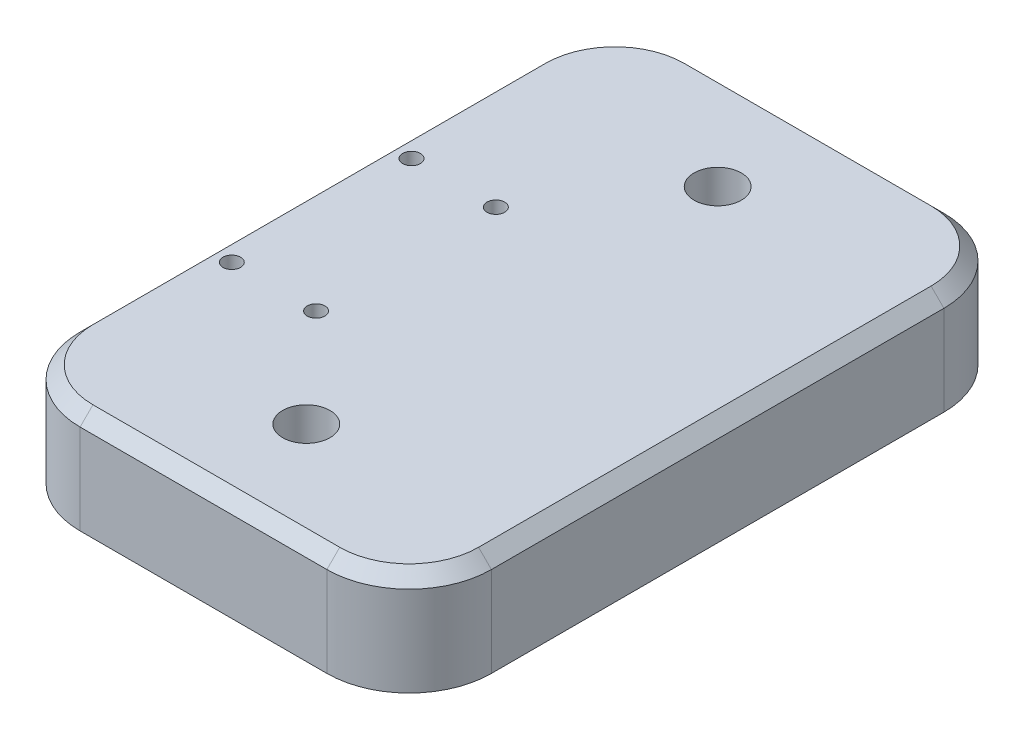
ISO-10303-21;
HEADER;
FILE_DESCRIPTION(('STEP AP214'),'2;1');
FILE_NAME('part.step','',(''),(''),'','','');
FILE_SCHEMA(('AUTOMOTIVE_DESIGN { 1 0 10303 214 1 1 1 1 }'));
ENDSEC;
DATA;
#1=APPLICATION_CONTEXT('core data for automotive mechanical design processes');
#2=APPLICATION_PROTOCOL_DEFINITION('international standard','automotive_design',2000,#1);
#3=PRODUCT_CONTEXT('',#1,'mechanical');
#4=PRODUCT('Part','Part','',(#3));
#5=PRODUCT_RELATED_PRODUCT_CATEGORY('part','',(#4));
#6=PRODUCT_DEFINITION_FORMATION('','',#4);
#7=PRODUCT_DEFINITION_CONTEXT('part definition',#1,'design');
#8=PRODUCT_DEFINITION('design','',#6,#7);
#9=PRODUCT_DEFINITION_SHAPE('','',#8);
#10=(LENGTH_UNIT() NAMED_UNIT(*) SI_UNIT(.MILLI.,.METRE.));
#11=(NAMED_UNIT(*) PLANE_ANGLE_UNIT() SI_UNIT($,.RADIAN.));
#12=(NAMED_UNIT(*) SI_UNIT($,.STERADIAN.) SOLID_ANGLE_UNIT());
#13=UNCERTAINTY_MEASURE_WITH_UNIT(LENGTH_MEASURE(1.E-05),#10,'distance_accuracy_value','');
#14=(GEOMETRIC_REPRESENTATION_CONTEXT(3) GLOBAL_UNCERTAINTY_ASSIGNED_CONTEXT((#13)) GLOBAL_UNIT_ASSIGNED_CONTEXT((#10,
#11,#12)) REPRESENTATION_CONTEXT('',''));
#15=CARTESIAN_POINT('',(0.,0.,0.));
#16=DIRECTION('',(0.,0.,1.));
#17=DIRECTION('',(1.,0.,0.));
#18=AXIS2_PLACEMENT_3D('',#15,#16,#17);
#19=CARTESIAN_POINT('',(50.8,12.7,0.));
#20=DIRECTION('',(0.,0.,-1.));
#21=DIRECTION('',(0.,1.,0.));
#22=AXIS2_PLACEMENT_3D('',#19,#20,#21);
#23=PLANE('',#22);
#24=DIRECTION('',(0.,-1.,0.));
#25=VECTOR('',#24,1.);
#26=CARTESIAN_POINT('',(40.64,12.7,0.));
#27=LINE('',#26,#25);
#28=CARTESIAN_POINT('',(40.64,0.,0.));
#29=VERTEX_POINT('',#28);
#30=CARTESIAN_POINT('',(40.64,11.1125,0.));
#31=VERTEX_POINT('',#30);
#32=EDGE_CURVE('E149',#29,#31,#27,.F.);
#33=ORIENTED_EDGE('',*,*,#32,.T.);
#34=DIRECTION('',(-1.,0.,0.));
#35=VECTOR('',#34,1.);
#36=CARTESIAN_POINT('',(50.8,11.1125,0.));
#37=LINE('',#36,#35);
#38=CARTESIAN_POINT('',(10.16,11.1125,0.));
#39=VERTEX_POINT('',#38);
#40=EDGE_CURVE('E225',#31,#39,#37,.T.);
#41=ORIENTED_EDGE('',*,*,#40,.T.);
#42=DIRECTION('',(0.,-1.,0.));
#43=VECTOR('',#42,1.);
#44=CARTESIAN_POINT('',(10.16,0.,0.));
#45=LINE('',#44,#43);
#46=CARTESIAN_POINT('',(10.16,0.,0.));
#47=VERTEX_POINT('',#46);
#48=EDGE_CURVE('E152',#39,#47,#45,.T.);
#49=ORIENTED_EDGE('',*,*,#48,.T.);
#50=DIRECTION('',(-1.,0.,0.));
#51=VECTOR('',#50,1.);
#52=CARTESIAN_POINT('',(50.8,0.,0.));
#53=LINE('',#52,#51);
#54=EDGE_CURVE('E137',#29,#47,#53,.T.);
#55=ORIENTED_EDGE('',*,*,#54,.F.);
#56=EDGE_LOOP('',(#33,#41,#49,#55));
#57=FACE_BOUND('',#56,.T.);
#58=ADVANCED_FACE('F41',(#57),#23,.F.);
#59=CARTESIAN_POINT('',(50.8,0.,-76.2));
#60=DIRECTION('',(0.,1.,0.));
#61=DIRECTION('',(0.,0.,1.));
#62=AXIS2_PLACEMENT_3D('',#59,#60,#61);
#63=PLANE('',#62);
#64=CARTESIAN_POINT('',(25.4,0.,-63.5));
#65=DIRECTION('',(0.,-1.,0.));
#66=DIRECTION('',(0.,0.,-1.));
#67=AXIS2_PLACEMENT_3D('',#64,#65,#66);
#68=CIRCLE('',#67,2.921);
#69=CARTESIAN_POINT('',(25.4,0.,-66.421));
#70=VERTEX_POINT('',#69);
#71=EDGE_CURVE('E288',#70,#70,#68,.T.);
#72=ORIENTED_EDGE('',*,*,#71,.F.);
#73=EDGE_LOOP('',(#72));
#74=FACE_BOUND('',#73,.T.);
#75=CARTESIAN_POINT('',(25.4,0.,-12.7));
#76=DIRECTION('',(0.,-1.,0.));
#77=DIRECTION('',(0.,0.,-1.));
#78=AXIS2_PLACEMENT_3D('',#75,#76,#77);
#79=CIRCLE('',#78,2.921);
#80=CARTESIAN_POINT('',(25.4,0.,-15.621));
#81=VERTEX_POINT('',#80);
#82=EDGE_CURVE('E296',#81,#81,#79,.T.);
#83=ORIENTED_EDGE('',*,*,#82,.F.);
#84=EDGE_LOOP('',(#83));
#85=FACE_BOUND('',#84,.T.);
#86=CARTESIAN_POINT('',(3.4925,0.,-25.4));
#87=DIRECTION('',(0.,-1.,0.));
#88=DIRECTION('',(0.,0.,-1.));
#89=AXIS2_PLACEMENT_3D('',#86,#87,#88);
#90=CIRCLE('',#89,1.0922);
#91=CARTESIAN_POINT('',(3.4925,0.,-26.4922));
#92=VERTEX_POINT('',#91);
#93=EDGE_CURVE('E304',#92,#92,#90,.T.);
#94=ORIENTED_EDGE('',*,*,#93,.F.);
#95=EDGE_LOOP('',(#94));
#96=FACE_BOUND('',#95,.T.);
#97=CARTESIAN_POINT('',(3.4925,0.,-47.5996));
#98=DIRECTION('',(0.,-1.,0.));
#99=DIRECTION('',(0.,0.,-1.));
#100=AXIS2_PLACEMENT_3D('',#97,#98,#99);
#101=CIRCLE('',#100,1.0922);
#102=CARTESIAN_POINT('',(3.4925,0.,-48.6918));
#103=VERTEX_POINT('',#102);
#104=EDGE_CURVE('E280',#103,#103,#101,.T.);
#105=ORIENTED_EDGE('',*,*,#104,.F.);
#106=EDGE_LOOP('',(#105));
#107=FACE_BOUND('',#106,.T.);
#108=CARTESIAN_POINT('',(13.9065,0.,-47.5996));
#109=DIRECTION('',(0.,-1.,0.));
#110=DIRECTION('',(0.,0.,-1.));
#111=AXIS2_PLACEMENT_3D('',#108,#109,#110);
#112=CIRCLE('',#111,1.0922);
#113=CARTESIAN_POINT('',(13.9065,0.,-48.6918));
#114=VERTEX_POINT('',#113);
#115=EDGE_CURVE('E267',#114,#114,#112,.T.);
#116=ORIENTED_EDGE('',*,*,#115,.F.);
#117=EDGE_LOOP('',(#116));
#118=FACE_BOUND('',#117,.T.);
#119=CARTESIAN_POINT('',(13.9065,0.,-25.4));
#120=DIRECTION('',(0.,-1.,0.));
#121=DIRECTION('',(0.,0.,-1.));
#122=AXIS2_PLACEMENT_3D('',#119,#120,#121);
#123=CIRCLE('',#122,1.0922);
#124=CARTESIAN_POINT('',(13.9065,0.,-26.4922));
#125=VERTEX_POINT('',#124);
#126=EDGE_CURVE('E287',#125,#125,#123,.T.);
#127=ORIENTED_EDGE('',*,*,#126,.F.);
#128=EDGE_LOOP('',(#127));
#129=FACE_BOUND('',#128,.T.);
#130=ORIENTED_EDGE('',*,*,#54,.T.);
#131=CARTESIAN_POINT('',(10.16,0.,-10.16));
#132=DIRECTION('',(0.,1.,0.));
#133=DIRECTION('',(0.,0.,1.));
#134=AXIS2_PLACEMENT_3D('',#131,#132,#133);
#135=CIRCLE('',#134,10.16);
#136=CARTESIAN_POINT('',(0.,0.,-10.16));
#137=VERTEX_POINT('',#136);
#138=EDGE_CURVE('E144',#47,#137,#135,.F.);
#139=ORIENTED_EDGE('',*,*,#138,.T.);
#140=DIRECTION('',(0.,0.,-1.));
#141=VECTOR('',#140,1.);
#142=CARTESIAN_POINT('',(0.,0.,-76.2));
#143=LINE('',#142,#141);
#144=CARTESIAN_POINT('',(0.,0.,-66.04));
#145=VERTEX_POINT('',#144);
#146=EDGE_CURVE('E319',#137,#145,#143,.T.);
#147=ORIENTED_EDGE('',*,*,#146,.T.);
#148=CARTESIAN_POINT('',(10.16,0.,-66.04));
#149=DIRECTION('',(0.,1.,0.));
#150=DIRECTION('',(0.,0.,1.));
#151=AXIS2_PLACEMENT_3D('',#148,#149,#150);
#152=CIRCLE('',#151,10.16);
#153=CARTESIAN_POINT('',(10.16,0.,-76.2));
#154=VERTEX_POINT('',#153);
#155=EDGE_CURVE('E145',#145,#154,#152,.F.);
#156=ORIENTED_EDGE('',*,*,#155,.T.);
#157=DIRECTION('',(-1.,0.,0.));
#158=VECTOR('',#157,1.);
#159=CARTESIAN_POINT('',(50.8,0.,-76.2));
#160=LINE('',#159,#158);
#161=CARTESIAN_POINT('',(40.64,0.,-76.2));
#162=VERTEX_POINT('',#161);
#163=EDGE_CURVE('E155',#162,#154,#160,.T.);
#164=ORIENTED_EDGE('',*,*,#163,.F.);
#165=CARTESIAN_POINT('',(40.64,0.,-66.04));
#166=DIRECTION('',(0.,1.,0.));
#167=DIRECTION('',(0.,0.,1.));
#168=AXIS2_PLACEMENT_3D('',#165,#166,#167);
#169=CIRCLE('',#168,10.16);
#170=CARTESIAN_POINT('',(50.8,0.,-66.04));
#171=VERTEX_POINT('',#170);
#172=EDGE_CURVE('E163',#162,#171,#169,.F.);
#173=ORIENTED_EDGE('',*,*,#172,.T.);
#174=DIRECTION('',(0.,0.,-1.));
#175=VECTOR('',#174,1.);
#176=CARTESIAN_POINT('',(50.8,0.,-76.2));
#177=LINE('',#176,#175);
#178=CARTESIAN_POINT('',(50.8,0.,-10.16));
#179=VERTEX_POINT('',#178);
#180=EDGE_CURVE('E139',#179,#171,#177,.T.);
#181=ORIENTED_EDGE('',*,*,#180,.F.);
#182=CARTESIAN_POINT('',(40.64,0.,-10.16));
#183=DIRECTION('',(0.,1.,0.));
#184=DIRECTION('',(0.,0.,1.));
#185=AXIS2_PLACEMENT_3D('',#182,#183,#184);
#186=CIRCLE('',#185,10.16);
#187=EDGE_CURVE('E134',#179,#29,#186,.F.);
#188=ORIENTED_EDGE('',*,*,#187,.T.);
#189=EDGE_LOOP('',(#130,#139,#147,#156,#164,#173,#181,#188));
#190=FACE_BOUND('',#189,.T.);
#191=ADVANCED_FACE('F136',(#74,#85,#96,#107,#118,#129,#190),#63,.F.);
#192=CARTESIAN_POINT('',(50.8,12.7,-76.2));
#193=DIRECTION('',(0.,0.,1.));
#194=DIRECTION('',(1.,0.,0.));
#195=AXIS2_PLACEMENT_3D('',#192,#193,#194);
#196=PLANE('',#195);
#197=DIRECTION('',(0.,1.,0.));
#198=VECTOR('',#197,1.);
#199=CARTESIAN_POINT('',(10.16,12.7,-76.2));
#200=LINE('',#199,#198);
#201=CARTESIAN_POINT('',(10.16,11.1125,-76.2));
#202=VERTEX_POINT('',#201);
#203=EDGE_CURVE('E190',#154,#202,#200,.T.);
#204=ORIENTED_EDGE('',*,*,#203,.T.);
#205=DIRECTION('',(1.,0.,0.));
#206=VECTOR('',#205,1.);
#207=CARTESIAN_POINT('',(50.8,11.1125,-76.2));
#208=LINE('',#207,#206);
#209=CARTESIAN_POINT('',(40.64,11.1125,-76.2));
#210=VERTEX_POINT('',#209);
#211=EDGE_CURVE('E52',#202,#210,#208,.T.);
#212=ORIENTED_EDGE('',*,*,#211,.T.);
#213=DIRECTION('',(0.,1.,0.));
#214=VECTOR('',#213,1.);
#215=CARTESIAN_POINT('',(40.64,12.7,-76.2));
#216=LINE('',#215,#214);
#217=EDGE_CURVE('E187',#210,#162,#216,.F.);
#218=ORIENTED_EDGE('',*,*,#217,.T.);
#219=ORIENTED_EDGE('',*,*,#163,.T.);
#220=EDGE_LOOP('',(#204,#212,#218,#219));
#221=FACE_BOUND('',#220,.T.);
#222=ADVANCED_FACE('F330',(#221),#196,.F.);
#223=CARTESIAN_POINT('',(50.8,12.7,0.));
#224=DIRECTION('',(0.,-1.,0.));
#225=DIRECTION('',(0.,0.,-1.));
#226=AXIS2_PLACEMENT_3D('',#223,#224,#225);
#227=PLANE('',#226);
#228=CARTESIAN_POINT('',(10.16,12.7,-66.04));
#229=DIRECTION('',(0.,-1.,0.));
#230=DIRECTION('',(0.,0.,-1.));
#231=AXIS2_PLACEMENT_3D('',#228,#229,#230);
#232=CIRCLE('',#231,8.5725);
#233=CARTESIAN_POINT('',(10.16,12.7,-74.6125));
#234=VERTEX_POINT('',#233);
#235=CARTESIAN_POINT('',(1.5875,12.7,-66.04));
#236=VERTEX_POINT('',#235);
#237=EDGE_CURVE('E193',#234,#236,#232,.F.);
#238=ORIENTED_EDGE('',*,*,#237,.T.);
#239=DIRECTION('',(0.,0.,1.));
#240=VECTOR('',#239,1.);
#241=CARTESIAN_POINT('',(1.5875,12.7,-10.16));
#242=LINE('',#241,#240);
#243=CARTESIAN_POINT('',(1.5875,12.7,-10.16));
#244=VERTEX_POINT('',#243);
#245=EDGE_CURVE('E214',#236,#244,#242,.T.);
#246=ORIENTED_EDGE('',*,*,#245,.T.);
#247=CARTESIAN_POINT('',(10.16,12.7,-10.16));
#248=DIRECTION('',(0.,-1.,0.));
#249=DIRECTION('',(0.,0.,-1.));
#250=AXIS2_PLACEMENT_3D('',#247,#248,#249);
#251=CIRCLE('',#250,8.5725);
#252=CARTESIAN_POINT('',(10.16,12.7,-1.5875));
#253=VERTEX_POINT('',#252);
#254=EDGE_CURVE('E211',#244,#253,#251,.F.);
#255=ORIENTED_EDGE('',*,*,#254,.T.);
#256=DIRECTION('',(1.,0.,0.));
#257=VECTOR('',#256,1.);
#258=CARTESIAN_POINT('',(50.8,12.7,-1.5875));
#259=LINE('',#258,#257);
#260=CARTESIAN_POINT('',(40.64,12.7,-1.5875));
#261=VERTEX_POINT('',#260);
#262=EDGE_CURVE('E208',#253,#261,#259,.T.);
#263=ORIENTED_EDGE('',*,*,#262,.T.);
#264=CARTESIAN_POINT('',(40.64,12.7,-10.16));
#265=DIRECTION('',(0.,-1.,0.));
#266=DIRECTION('',(0.,0.,-1.));
#267=AXIS2_PLACEMENT_3D('',#264,#265,#266);
#268=CIRCLE('',#267,8.5725);
#269=CARTESIAN_POINT('',(49.2125,12.7,-10.16));
#270=VERTEX_POINT('',#269);
#271=EDGE_CURVE('E205',#261,#270,#268,.F.);
#272=ORIENTED_EDGE('',*,*,#271,.T.);
#273=DIRECTION('',(0.,0.,-1.));
#274=VECTOR('',#273,1.);
#275=CARTESIAN_POINT('',(49.2125,12.7,0.));
#276=LINE('',#275,#274);
#277=CARTESIAN_POINT('',(49.2125,12.7,-66.04));
#278=VERTEX_POINT('',#277);
#279=EDGE_CURVE('E202',#270,#278,#276,.T.);
#280=ORIENTED_EDGE('',*,*,#279,.T.);
#281=CARTESIAN_POINT('',(40.64,12.7,-66.04));
#282=DIRECTION('',(0.,-1.,0.));
#283=DIRECTION('',(0.,0.,-1.));
#284=AXIS2_PLACEMENT_3D('',#281,#282,#283);
#285=CIRCLE('',#284,8.57250000000001);
#286=CARTESIAN_POINT('',(40.64,12.7,-74.6125));
#287=VERTEX_POINT('',#286);
#288=EDGE_CURVE('E199',#278,#287,#285,.F.);
#289=ORIENTED_EDGE('',*,*,#288,.T.);
#290=DIRECTION('',(-1.,0.,0.));
#291=VECTOR('',#290,1.);
#292=CARTESIAN_POINT('',(50.8,12.7,-74.6125));
#293=LINE('',#292,#291);
#294=EDGE_CURVE('E196',#287,#234,#293,.T.);
#295=ORIENTED_EDGE('',*,*,#294,.T.);
#296=EDGE_LOOP('',(#238,#246,#255,#263,#272,#280,#289,#295));
#297=FACE_BOUND('',#296,.T.);
#298=CARTESIAN_POINT('',(25.4,12.7,-63.5));
#299=DIRECTION('',(0.,-1.,0.));
#300=DIRECTION('',(0.,0.,-1.));
#301=AXIS2_PLACEMENT_3D('',#298,#299,#300);
#302=CIRCLE('',#301,2.921);
#303=CARTESIAN_POINT('',(25.4,12.7,-66.421));
#304=VERTEX_POINT('',#303);
#305=EDGE_CURVE('E283',#304,#304,#302,.T.);
#306=ORIENTED_EDGE('',*,*,#305,.T.);
#307=EDGE_LOOP('',(#306));
#308=FACE_BOUND('',#307,.T.);
#309=CARTESIAN_POINT('',(25.4,12.7,-12.7));
#310=DIRECTION('',(0.,-1.,0.));
#311=DIRECTION('',(0.,0.,-1.));
#312=AXIS2_PLACEMENT_3D('',#309,#310,#311);
#313=CIRCLE('',#312,2.921);
#314=CARTESIAN_POINT('',(25.4,12.7,-15.621));
#315=VERTEX_POINT('',#314);
#316=EDGE_CURVE('E292',#315,#315,#313,.T.);
#317=ORIENTED_EDGE('',*,*,#316,.T.);
#318=EDGE_LOOP('',(#317));
#319=FACE_BOUND('',#318,.T.);
#320=CARTESIAN_POINT('',(3.4925,12.7,-25.4));
#321=DIRECTION('',(0.,-1.,0.));
#322=DIRECTION('',(0.,0.,-1.));
#323=AXIS2_PLACEMENT_3D('',#320,#321,#322);
#324=CIRCLE('',#323,1.0922);
#325=CARTESIAN_POINT('',(3.4925,12.7,-26.4922));
#326=VERTEX_POINT('',#325);
#327=EDGE_CURVE('E300',#326,#326,#324,.T.);
#328=ORIENTED_EDGE('',*,*,#327,.T.);
#329=EDGE_LOOP('',(#328));
#330=FACE_BOUND('',#329,.T.);
#331=CARTESIAN_POINT('',(3.4925,12.7,-47.5996));
#332=DIRECTION('',(0.,-1.,0.));
#333=DIRECTION('',(0.,0.,-1.));
#334=AXIS2_PLACEMENT_3D('',#331,#332,#333);
#335=CIRCLE('',#334,1.0922);
#336=CARTESIAN_POINT('',(3.4925,12.7,-48.6918));
#337=VERTEX_POINT('',#336);
#338=EDGE_CURVE('E308',#337,#337,#335,.T.);
#339=ORIENTED_EDGE('',*,*,#338,.T.);
#340=EDGE_LOOP('',(#339));
#341=FACE_BOUND('',#340,.T.);
#342=CARTESIAN_POINT('',(13.9065,12.7,-47.5996));
#343=DIRECTION('',(0.,-1.,0.));
#344=DIRECTION('',(0.,0.,-1.));
#345=AXIS2_PLACEMENT_3D('',#342,#343,#344);
#346=CIRCLE('',#345,1.0922);
#347=CARTESIAN_POINT('',(13.9065,12.7,-48.6918));
#348=VERTEX_POINT('',#347);
#349=EDGE_CURVE('E274',#348,#348,#346,.T.);
#350=ORIENTED_EDGE('',*,*,#349,.T.);
#351=EDGE_LOOP('',(#350));
#352=FACE_BOUND('',#351,.T.);
#353=CARTESIAN_POINT('',(13.9065,12.7,-25.4));
#354=DIRECTION('',(0.,-1.,0.));
#355=DIRECTION('',(0.,0.,-1.));
#356=AXIS2_PLACEMENT_3D('',#353,#354,#355);
#357=CIRCLE('',#356,1.0922);
#358=CARTESIAN_POINT('',(13.9065,12.7,-26.4922));
#359=VERTEX_POINT('',#358);
#360=EDGE_CURVE('E315',#359,#359,#357,.T.);
#361=ORIENTED_EDGE('',*,*,#360,.T.);
#362=EDGE_LOOP('',(#361));
#363=FACE_BOUND('',#362,.T.);
#364=ADVANCED_FACE('F374',(#297,#308,#319,#330,#341,#352,#363),#227,.F.);
#365=CARTESIAN_POINT('',(50.8,0.,0.));
#366=DIRECTION('',(-1.,0.,0.));
#367=DIRECTION('',(0.,0.,1.));
#368=AXIS2_PLACEMENT_3D('',#365,#366,#367);
#369=PLANE('',#368);
#370=DIRECTION('',(0.,1.,0.));
#371=VECTOR('',#370,1.);
#372=CARTESIAN_POINT('',(50.8,0.,-66.04));
#373=LINE('',#372,#371);
#374=CARTESIAN_POINT('',(50.8,11.1125,-66.04));
#375=VERTEX_POINT('',#374);
#376=EDGE_CURVE('E180',#171,#375,#373,.T.);
#377=ORIENTED_EDGE('',*,*,#376,.T.);
#378=DIRECTION('',(0.,0.,1.));
#379=VECTOR('',#378,1.);
#380=CARTESIAN_POINT('',(50.8,11.1125,0.));
#381=LINE('',#380,#379);
#382=CARTESIAN_POINT('',(50.8,11.1125,-10.16));
#383=VERTEX_POINT('',#382);
#384=EDGE_CURVE('E230',#375,#383,#381,.T.);
#385=ORIENTED_EDGE('',*,*,#384,.T.);
#386=DIRECTION('',(0.,-1.,0.));
#387=VECTOR('',#386,1.);
#388=CARTESIAN_POINT('',(50.8,0.,-10.16));
#389=LINE('',#388,#387);
#390=EDGE_CURVE('E184',#383,#179,#389,.T.);
#391=ORIENTED_EDGE('',*,*,#390,.T.);
#392=ORIENTED_EDGE('',*,*,#180,.T.);
#393=EDGE_LOOP('',(#377,#385,#391,#392));
#394=FACE_BOUND('',#393,.T.);
#395=ADVANCED_FACE('F365',(#394),#369,.F.);
#396=CARTESIAN_POINT('',(0.,0.,0.));
#397=DIRECTION('',(-1.,0.,0.));
#398=DIRECTION('',(0.,0.,1.));
#399=AXIS2_PLACEMENT_3D('',#396,#397,#398);
#400=PLANE('',#399);
#401=DIRECTION('',(0.,-1.,0.));
#402=VECTOR('',#401,1.);
#403=CARTESIAN_POINT('',(0.,12.7,-10.16));
#404=LINE('',#403,#402);
#405=CARTESIAN_POINT('',(0.,11.1125,-10.16));
#406=VERTEX_POINT('',#405);
#407=EDGE_CURVE('E176',#137,#406,#404,.F.);
#408=ORIENTED_EDGE('',*,*,#407,.T.);
#409=DIRECTION('',(0.,0.,-1.));
#410=VECTOR('',#409,1.);
#411=CARTESIAN_POINT('',(0.,11.1125,-66.04));
#412=LINE('',#411,#410);
#413=CARTESIAN_POINT('',(0.,11.1125,-66.04));
#414=VERTEX_POINT('',#413);
#415=EDGE_CURVE('E218',#406,#414,#412,.T.);
#416=ORIENTED_EDGE('',*,*,#415,.T.);
#417=DIRECTION('',(0.,1.,0.));
#418=VECTOR('',#417,1.);
#419=CARTESIAN_POINT('',(0.,0.,-66.04));
#420=LINE('',#419,#418);
#421=EDGE_CURVE('E173',#414,#145,#420,.F.);
#422=ORIENTED_EDGE('',*,*,#421,.T.);
#423=ORIENTED_EDGE('',*,*,#146,.F.);
#424=EDGE_LOOP('',(#408,#416,#422,#423));
#425=FACE_BOUND('',#424,.T.);
#426=ADVANCED_FACE('F337',(#425),#400,.T.);
#427=CARTESIAN_POINT('',(13.9065,12.7,-25.4));
#428=DIRECTION('',(0.,-1.,0.));
#429=DIRECTION('',(0.,0.,-1.));
#430=AXIS2_PLACEMENT_3D('',#427,#428,#429);
#431=CYLINDRICAL_SURFACE('',#430,1.0922);
#432=ORIENTED_EDGE('',*,*,#360,.F.);
#433=EDGE_LOOP('',(#432));
#434=FACE_BOUND('',#433,.T.);
#435=ORIENTED_EDGE('',*,*,#126,.T.);
#436=EDGE_LOOP('',(#435));
#437=FACE_BOUND('',#436,.T.);
#438=ADVANCED_FACE('F390',(#434,#437),#431,.F.);
#439=CARTESIAN_POINT('',(13.9065,12.7,-47.5996));
#440=DIRECTION('',(0.,-1.,0.));
#441=DIRECTION('',(0.,0.,-1.));
#442=AXIS2_PLACEMENT_3D('',#439,#440,#441);
#443=CYLINDRICAL_SURFACE('',#442,1.0922);
#444=ORIENTED_EDGE('',*,*,#349,.F.);
#445=EDGE_LOOP('',(#444));
#446=FACE_BOUND('',#445,.T.);
#447=ORIENTED_EDGE('',*,*,#115,.T.);
#448=EDGE_LOOP('',(#447));
#449=FACE_BOUND('',#448,.T.);
#450=ADVANCED_FACE('F393',(#446,#449),#443,.F.);
#451=CARTESIAN_POINT('',(3.4925,12.7,-47.5996));
#452=DIRECTION('',(0.,-1.,0.));
#453=DIRECTION('',(0.,0.,-1.));
#454=AXIS2_PLACEMENT_3D('',#451,#452,#453);
#455=CYLINDRICAL_SURFACE('',#454,1.0922);
#456=ORIENTED_EDGE('',*,*,#338,.F.);
#457=EDGE_LOOP('',(#456));
#458=FACE_BOUND('',#457,.T.);
#459=ORIENTED_EDGE('',*,*,#104,.T.);
#460=EDGE_LOOP('',(#459));
#461=FACE_BOUND('',#460,.T.);
#462=ADVANCED_FACE('F495',(#458,#461),#455,.F.);
#463=CARTESIAN_POINT('',(3.4925,12.7,-25.4));
#464=DIRECTION('',(0.,-1.,0.));
#465=DIRECTION('',(0.,0.,-1.));
#466=AXIS2_PLACEMENT_3D('',#463,#464,#465);
#467=CYLINDRICAL_SURFACE('',#466,1.0922);
#468=ORIENTED_EDGE('',*,*,#327,.F.);
#469=EDGE_LOOP('',(#468));
#470=FACE_BOUND('',#469,.T.);
#471=ORIENTED_EDGE('',*,*,#93,.T.);
#472=EDGE_LOOP('',(#471));
#473=FACE_BOUND('',#472,.T.);
#474=ADVANCED_FACE('F487',(#470,#473),#467,.F.);
#475=CARTESIAN_POINT('',(25.4,12.7,-12.7));
#476=DIRECTION('',(0.,-1.,0.));
#477=DIRECTION('',(0.,0.,-1.));
#478=AXIS2_PLACEMENT_3D('',#475,#476,#477);
#479=CYLINDRICAL_SURFACE('',#478,2.921);
#480=ORIENTED_EDGE('',*,*,#316,.F.);
#481=EDGE_LOOP('',(#480));
#482=FACE_BOUND('',#481,.T.);
#483=ORIENTED_EDGE('',*,*,#82,.T.);
#484=EDGE_LOOP('',(#483));
#485=FACE_BOUND('',#484,.T.);
#486=ADVANCED_FACE('F479',(#482,#485),#479,.F.);
#487=CARTESIAN_POINT('',(25.4,12.7,-63.5));
#488=DIRECTION('',(0.,-1.,0.));
#489=DIRECTION('',(0.,0.,-1.));
#490=AXIS2_PLACEMENT_3D('',#487,#488,#489);
#491=CYLINDRICAL_SURFACE('',#490,2.921);
#492=ORIENTED_EDGE('',*,*,#305,.F.);
#493=EDGE_LOOP('',(#492));
#494=FACE_BOUND('',#493,.T.);
#495=ORIENTED_EDGE('',*,*,#71,.T.);
#496=EDGE_LOOP('',(#495));
#497=FACE_BOUND('',#496,.T.);
#498=ADVANCED_FACE('F411',(#494,#497),#491,.F.);
#499=CARTESIAN_POINT('',(10.16,12.7,-10.16));
#500=DIRECTION('',(0.,1.,0.));
#501=DIRECTION('',(0.,0.,1.));
#502=AXIS2_PLACEMENT_3D('',#499,#500,#501);
#503=CYLINDRICAL_SURFACE('',#502,10.16);
#504=ORIENTED_EDGE('',*,*,#48,.F.);
#505=CARTESIAN_POINT('',(10.16,11.1125,-10.16));
#506=DIRECTION('',(0.,-1.,0.));
#507=DIRECTION('',(0.,0.,-1.));
#508=AXIS2_PLACEMENT_3D('',#505,#506,#507);
#509=CIRCLE('',#508,10.16);
#510=EDGE_CURVE('E222',#39,#406,#509,.T.);
#511=ORIENTED_EDGE('',*,*,#510,.T.);
#512=ORIENTED_EDGE('',*,*,#407,.F.);
#513=ORIENTED_EDGE('',*,*,#138,.F.);
#514=EDGE_LOOP('',(#504,#511,#512,#513));
#515=FACE_BOUND('',#514,.T.);
#516=ADVANCED_FACE('F340',(#515),#503,.T.);
#517=CARTESIAN_POINT('',(40.64,0.,-10.16));
#518=DIRECTION('',(0.,-1.,0.));
#519=DIRECTION('',(0.,0.,-1.));
#520=AXIS2_PLACEMENT_3D('',#517,#518,#519);
#521=CYLINDRICAL_SURFACE('',#520,10.16);
#522=ORIENTED_EDGE('',*,*,#390,.F.);
#523=CARTESIAN_POINT('',(40.64,11.1125,-10.16));
#524=DIRECTION('',(0.,-1.,0.));
#525=DIRECTION('',(0.,0.,-1.));
#526=AXIS2_PLACEMENT_3D('',#523,#524,#525);
#527=CIRCLE('',#526,10.16);
#528=EDGE_CURVE('E159',#383,#31,#527,.T.);
#529=ORIENTED_EDGE('',*,*,#528,.T.);
#530=ORIENTED_EDGE('',*,*,#32,.F.);
#531=ORIENTED_EDGE('',*,*,#187,.F.);
#532=EDGE_LOOP('',(#522,#529,#530,#531));
#533=FACE_BOUND('',#532,.T.);
#534=ADVANCED_FACE('F157',(#533),#521,.T.);
#535=CARTESIAN_POINT('',(10.16,12.7,-66.04));
#536=DIRECTION('',(0.,-1.,0.));
#537=DIRECTION('',(0.,0.,-1.));
#538=AXIS2_PLACEMENT_3D('',#535,#536,#537);
#539=CYLINDRICAL_SURFACE('',#538,10.16);
#540=ORIENTED_EDGE('',*,*,#421,.F.);
#541=CARTESIAN_POINT('',(10.16,11.1125,-66.04));
#542=DIRECTION('',(0.,-1.,0.));
#543=DIRECTION('',(0.,0.,-1.));
#544=AXIS2_PLACEMENT_3D('',#541,#542,#543);
#545=CIRCLE('',#544,10.16);
#546=EDGE_CURVE('E11',#414,#202,#545,.T.);
#547=ORIENTED_EDGE('',*,*,#546,.T.);
#548=ORIENTED_EDGE('',*,*,#203,.F.);
#549=ORIENTED_EDGE('',*,*,#155,.F.);
#550=EDGE_LOOP('',(#540,#547,#548,#549));
#551=FACE_BOUND('',#550,.T.);
#552=ADVANCED_FACE('F333',(#551),#539,.T.);
#553=CARTESIAN_POINT('',(40.64,0.,-66.04));
#554=DIRECTION('',(0.,1.,0.));
#555=DIRECTION('',(0.,0.,1.));
#556=AXIS2_PLACEMENT_3D('',#553,#554,#555);
#557=CYLINDRICAL_SURFACE('',#556,10.16);
#558=ORIENTED_EDGE('',*,*,#217,.F.);
#559=CARTESIAN_POINT('',(40.64,11.1125,-66.04));
#560=DIRECTION('',(0.,-1.,0.));
#561=DIRECTION('',(0.,0.,-1.));
#562=AXIS2_PLACEMENT_3D('',#559,#560,#561);
#563=CIRCLE('',#562,10.16);
#564=EDGE_CURVE('E233',#210,#375,#563,.T.);
#565=ORIENTED_EDGE('',*,*,#564,.T.);
#566=ORIENTED_EDGE('',*,*,#376,.F.);
#567=ORIENTED_EDGE('',*,*,#172,.F.);
#568=EDGE_LOOP('',(#558,#565,#566,#567));
#569=FACE_BOUND('',#568,.T.);
#570=ADVANCED_FACE('F362',(#569),#557,.T.);
#571=CARTESIAN_POINT('',(50.8,11.1125,0.));
#572=DIRECTION('',(-0.707106781186548,-0.707106781186547,0.));
#573=DIRECTION('',(0.,0.,1.));
#574=AXIS2_PLACEMENT_3D('',#571,#572,#573);
#575=PLANE('',#574);
#576=DIRECTION('',(-0.707106781186547,0.707106781186548,0.));
#577=VECTOR('',#576,1.);
#578=CARTESIAN_POINT('',(50.8,11.1125,-10.16));
#579=LINE('',#578,#577);
#580=EDGE_CURVE('E259',#383,#270,#579,.T.);
#581=ORIENTED_EDGE('',*,*,#580,.F.);
#582=ORIENTED_EDGE('',*,*,#384,.F.);
#583=DIRECTION('',(0.707106781186547,-0.707106781186548,0.));
#584=VECTOR('',#583,1.);
#585=CARTESIAN_POINT('',(49.2125,12.7,-66.04));
#586=LINE('',#585,#584);
#587=EDGE_CURVE('E46',#278,#375,#586,.T.);
#588=ORIENTED_EDGE('',*,*,#587,.F.);
#589=ORIENTED_EDGE('',*,*,#279,.F.);
#590=EDGE_LOOP('',(#581,#582,#588,#589));
#591=FACE_BOUND('',#590,.T.);
#592=ADVANCED_FACE('F44',(#591),#575,.F.);
#593=CARTESIAN_POINT('',(40.64,12.7,-66.04));
#594=DIRECTION('',(0.,-1.,0.));
#595=DIRECTION('',(0.,0.,-1.));
#596=AXIS2_PLACEMENT_3D('',#593,#594,#595);
#597=CONICAL_SURFACE('',#596,8.57250000000001,0.785398163397445);
#598=ORIENTED_EDGE('',*,*,#587,.T.);
#599=ORIENTED_EDGE('',*,*,#564,.F.);
#600=DIRECTION('',(0.,-0.707106781186549,-0.707106781186546));
#601=VECTOR('',#600,1.);
#602=CARTESIAN_POINT('',(40.64,12.7,-74.6125));
#603=LINE('',#602,#601);
#604=EDGE_CURVE('E256',#287,#210,#603,.T.);
#605=ORIENTED_EDGE('',*,*,#604,.F.);
#606=ORIENTED_EDGE('',*,*,#288,.F.);
#607=EDGE_LOOP('',(#598,#599,#605,#606));
#608=FACE_BOUND('',#607,.T.);
#609=ADVANCED_FACE('F359',(#608),#597,.T.);
#610=CARTESIAN_POINT('',(40.64,12.7,-10.16));
#611=DIRECTION('',(0.,-1.,0.));
#612=DIRECTION('',(0.,0.,-1.));
#613=AXIS2_PLACEMENT_3D('',#610,#611,#612);
#614=CONICAL_SURFACE('',#613,8.5725,0.785398163397447);
#615=ORIENTED_EDGE('',*,*,#580,.T.);
#616=ORIENTED_EDGE('',*,*,#271,.F.);
#617=DIRECTION('',(0.,0.707106781186548,-0.707106781186547));
#618=VECTOR('',#617,1.);
#619=CARTESIAN_POINT('',(40.64,11.1125,0.));
#620=LINE('',#619,#618);
#621=EDGE_CURVE('E252',#31,#261,#620,.T.);
#622=ORIENTED_EDGE('',*,*,#621,.F.);
#623=ORIENTED_EDGE('',*,*,#528,.F.);
#624=EDGE_LOOP('',(#615,#616,#622,#623));
#625=FACE_BOUND('',#624,.T.);
#626=ADVANCED_FACE('F368',(#625),#614,.T.);
#627=CARTESIAN_POINT('',(50.8,12.7,-74.6125));
#628=DIRECTION('',(0.,-0.707106781186546,0.707106781186549));
#629=DIRECTION('',(-1.,0.,0.));
#630=AXIS2_PLACEMENT_3D('',#627,#628,#629);
#631=PLANE('',#630);
#632=ORIENTED_EDGE('',*,*,#604,.T.);
#633=ORIENTED_EDGE('',*,*,#211,.F.);
#634=DIRECTION('',(0.,-0.707106781186549,-0.707106781186546));
#635=VECTOR('',#634,1.);
#636=CARTESIAN_POINT('',(10.16,12.7,-74.6125));
#637=LINE('',#636,#635);
#638=EDGE_CURVE('E248',#234,#202,#637,.T.);
#639=ORIENTED_EDGE('',*,*,#638,.F.);
#640=ORIENTED_EDGE('',*,*,#294,.F.);
#641=EDGE_LOOP('',(#632,#633,#639,#640));
#642=FACE_BOUND('',#641,.T.);
#643=ADVANCED_FACE('F357',(#642),#631,.F.);
#644=CARTESIAN_POINT('',(50.8,11.1125,0.));
#645=DIRECTION('',(0.,-0.707106781186547,-0.707106781186548));
#646=DIRECTION('',(-1.,0.,0.));
#647=AXIS2_PLACEMENT_3D('',#644,#645,#646);
#648=PLANE('',#647);
#649=ORIENTED_EDGE('',*,*,#621,.T.);
#650=ORIENTED_EDGE('',*,*,#262,.F.);
#651=DIRECTION('',(0.,0.707106781186548,-0.707106781186547));
#652=VECTOR('',#651,1.);
#653=CARTESIAN_POINT('',(10.16,11.1125,0.));
#654=LINE('',#653,#652);
#655=EDGE_CURVE('E244',#39,#253,#654,.T.);
#656=ORIENTED_EDGE('',*,*,#655,.F.);
#657=ORIENTED_EDGE('',*,*,#40,.F.);
#658=EDGE_LOOP('',(#649,#650,#656,#657));
#659=FACE_BOUND('',#658,.T.);
#660=ADVANCED_FACE('F372',(#659),#648,.F.);
#661=CARTESIAN_POINT('',(10.16,12.7,-66.04));
#662=DIRECTION('',(0.,-1.,0.));
#663=DIRECTION('',(0.,0.,-1.));
#664=AXIS2_PLACEMENT_3D('',#661,#662,#663);
#665=CONICAL_SURFACE('',#664,8.5725,0.785398163397447);
#666=ORIENTED_EDGE('',*,*,#638,.T.);
#667=ORIENTED_EDGE('',*,*,#546,.F.);
#668=DIRECTION('',(-0.707106781186547,-0.707106781186548,0.));
#669=VECTOR('',#668,1.);
#670=CARTESIAN_POINT('',(1.5875,12.7,-66.04));
#671=LINE('',#670,#669);
#672=EDGE_CURVE('E241',#236,#414,#671,.T.);
#673=ORIENTED_EDGE('',*,*,#672,.F.);
#674=ORIENTED_EDGE('',*,*,#237,.F.);
#675=EDGE_LOOP('',(#666,#667,#673,#674));
#676=FACE_BOUND('',#675,.T.);
#677=ADVANCED_FACE('F353',(#676),#665,.T.);
#678=CARTESIAN_POINT('',(10.16,12.7,-10.16));
#679=DIRECTION('',(0.,-1.,0.));
#680=DIRECTION('',(0.,0.,-1.));
#681=AXIS2_PLACEMENT_3D('',#678,#679,#680);
#682=CONICAL_SURFACE('',#681,8.5725,0.785398163397447);
#683=ORIENTED_EDGE('',*,*,#655,.T.);
#684=ORIENTED_EDGE('',*,*,#254,.F.);
#685=DIRECTION('',(0.707106781186547,0.707106781186548,0.));
#686=VECTOR('',#685,1.);
#687=CARTESIAN_POINT('',(0.,11.1125,-10.16));
#688=LINE('',#687,#686);
#689=EDGE_CURVE('E238',#406,#244,#688,.T.);
#690=ORIENTED_EDGE('',*,*,#689,.F.);
#691=ORIENTED_EDGE('',*,*,#510,.F.);
#692=EDGE_LOOP('',(#683,#684,#690,#691));
#693=FACE_BOUND('',#692,.T.);
#694=ADVANCED_FACE('F345',(#693),#682,.T.);
#695=CARTESIAN_POINT('',(1.5875,12.7,0.));
#696=DIRECTION('',(-0.707106781186548,0.707106781186547,0.));
#697=DIRECTION('',(0.,0.,-1.));
#698=AXIS2_PLACEMENT_3D('',#695,#696,#697);
#699=PLANE('',#698);
#700=ORIENTED_EDGE('',*,*,#672,.T.);
#701=ORIENTED_EDGE('',*,*,#415,.F.);
#702=ORIENTED_EDGE('',*,*,#689,.T.);
#703=ORIENTED_EDGE('',*,*,#245,.F.);
#704=EDGE_LOOP('',(#700,#701,#702,#703));
#705=FACE_BOUND('',#704,.T.);
#706=ADVANCED_FACE('F349',(#705),#699,.T.);
#707=CLOSED_SHELL('',(#58,#191,#222,#364,#395,#426,#438,#450,#462,#474,#486,#498,#516,#534,#552,
#570,#592,#609,#626,#643,#660,#677,#694,#706));
#708=MANIFOLD_SOLID_BREP('B2',#707);
#709=ADVANCED_BREP_SHAPE_REPRESENTATION('',(#18,#708),#14);
#710=SHAPE_DEFINITION_REPRESENTATION(#9,#709);
ENDSEC;
END-ISO-10303-21;
